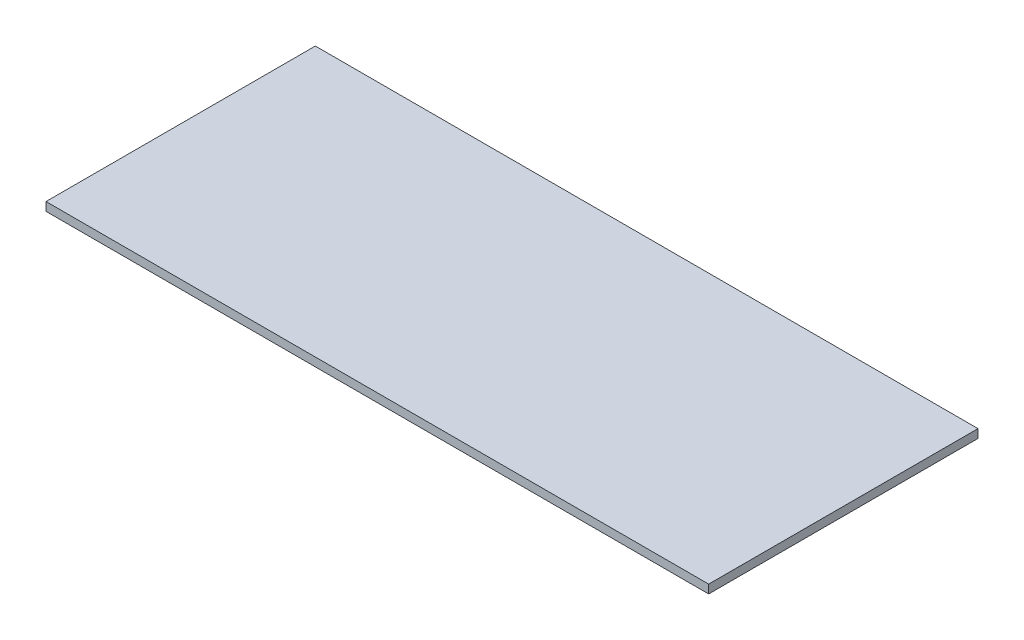
ISO-10303-21;
HEADER;
FILE_DESCRIPTION(('STEP AP214'),'2;1');
FILE_NAME('part.step','',(''),(''),'','','');
FILE_SCHEMA(('AUTOMOTIVE_DESIGN { 1 0 10303 214 1 1 1 1 }'));
ENDSEC;
DATA;
#1=APPLICATION_CONTEXT('core data for automotive mechanical design processes');
#2=APPLICATION_PROTOCOL_DEFINITION('international standard','automotive_design',2000,#1);
#3=PRODUCT_CONTEXT('',#1,'mechanical');
#4=PRODUCT('Part','Part','',(#3));
#5=PRODUCT_RELATED_PRODUCT_CATEGORY('part','',(#4));
#6=PRODUCT_DEFINITION_FORMATION('','',#4);
#7=PRODUCT_DEFINITION_CONTEXT('part definition',#1,'design');
#8=PRODUCT_DEFINITION('design','',#6,#7);
#9=PRODUCT_DEFINITION_SHAPE('','',#8);
#10=(LENGTH_UNIT() NAMED_UNIT(*) SI_UNIT(.MILLI.,.METRE.));
#11=(NAMED_UNIT(*) PLANE_ANGLE_UNIT() SI_UNIT($,.RADIAN.));
#12=(NAMED_UNIT(*) SI_UNIT($,.STERADIAN.) SOLID_ANGLE_UNIT());
#13=UNCERTAINTY_MEASURE_WITH_UNIT(LENGTH_MEASURE(1.E-05),#10,'distance_accuracy_value','');
#14=(GEOMETRIC_REPRESENTATION_CONTEXT(3) GLOBAL_UNCERTAINTY_ASSIGNED_CONTEXT((#13)) GLOBAL_UNIT_ASSIGNED_CONTEXT((#10,
#11,#12)) REPRESENTATION_CONTEXT('',''));
#15=CARTESIAN_POINT('',(0.,0.,0.));
#16=DIRECTION('',(0.,0.,1.));
#17=DIRECTION('',(1.,0.,0.));
#18=AXIS2_PLACEMENT_3D('',#15,#16,#17);
#19=CARTESIAN_POINT('',(196.85,5.08,-80.01));
#20=DIRECTION('',(-1.,0.,0.));
#21=DIRECTION('',(0.,0.,1.));
#22=AXIS2_PLACEMENT_3D('',#19,#20,#21);
#23=PLANE('',#22);
#24=DIRECTION('',(0.,0.,-1.));
#25=VECTOR('',#24,1.);
#26=CARTESIAN_POINT('',(196.85,0.,-80.01));
#27=LINE('',#26,#25);
#28=CARTESIAN_POINT('',(196.85,0.,80.01));
#29=VERTEX_POINT('',#28);
#30=CARTESIAN_POINT('',(196.85,0.,-80.01));
#31=VERTEX_POINT('',#30);
#32=EDGE_CURVE('E113',#29,#31,#27,.T.);
#33=ORIENTED_EDGE('',*,*,#32,.T.);
#34=DIRECTION('',(0.,-1.,0.));
#35=VECTOR('',#34,1.);
#36=CARTESIAN_POINT('',(196.85,5.08,-80.01));
#37=LINE('',#36,#35);
#38=CARTESIAN_POINT('',(196.85,5.08,-80.01));
#39=VERTEX_POINT('',#38);
#40=EDGE_CURVE('E11',#39,#31,#37,.T.);
#41=ORIENTED_EDGE('',*,*,#40,.F.);
#42=DIRECTION('',(0.,0.,-1.));
#43=VECTOR('',#42,1.);
#44=CARTESIAN_POINT('',(196.85,5.08,-80.01));
#45=LINE('',#44,#43);
#46=CARTESIAN_POINT('',(196.85,5.08,80.01));
#47=VERTEX_POINT('',#46);
#48=EDGE_CURVE('E97',#47,#39,#45,.T.);
#49=ORIENTED_EDGE('',*,*,#48,.F.);
#50=DIRECTION('',(0.,-1.,0.));
#51=VECTOR('',#50,1.);
#52=CARTESIAN_POINT('',(196.85,5.08,80.01));
#53=LINE('',#52,#51);
#54=EDGE_CURVE('E109',#47,#29,#53,.T.);
#55=ORIENTED_EDGE('',*,*,#54,.T.);
#56=EDGE_LOOP('',(#33,#41,#49,#55));
#57=FACE_BOUND('',#56,.T.);
#58=ADVANCED_FACE('F45',(#57),#23,.F.);
#59=CARTESIAN_POINT('',(-196.85,5.08,-80.01));
#60=DIRECTION('',(0.,0.,1.));
#61=DIRECTION('',(1.,0.,0.));
#62=AXIS2_PLACEMENT_3D('',#59,#60,#61);
#63=PLANE('',#62);
#64=DIRECTION('',(-1.,0.,0.));
#65=VECTOR('',#64,1.);
#66=CARTESIAN_POINT('',(-196.85,0.,-80.01));
#67=LINE('',#66,#65);
#68=CARTESIAN_POINT('',(-196.85,0.,-80.01));
#69=VERTEX_POINT('',#68);
#70=EDGE_CURVE('E102',#31,#69,#67,.T.);
#71=ORIENTED_EDGE('',*,*,#70,.T.);
#72=DIRECTION('',(0.,-1.,0.));
#73=VECTOR('',#72,1.);
#74=CARTESIAN_POINT('',(-196.85,5.08,-80.01));
#75=LINE('',#74,#73);
#76=CARTESIAN_POINT('',(-196.85,5.08,-80.01));
#77=VERTEX_POINT('',#76);
#78=EDGE_CURVE('E54',#77,#69,#75,.T.);
#79=ORIENTED_EDGE('',*,*,#78,.F.);
#80=DIRECTION('',(-1.,0.,0.));
#81=VECTOR('',#80,1.);
#82=CARTESIAN_POINT('',(-196.85,5.08,-80.01));
#83=LINE('',#82,#81);
#84=EDGE_CURVE('E92',#39,#77,#83,.T.);
#85=ORIENTED_EDGE('',*,*,#84,.F.);
#86=ORIENTED_EDGE('',*,*,#40,.T.);
#87=EDGE_LOOP('',(#71,#79,#85,#86));
#88=FACE_BOUND('',#87,.T.);
#89=ADVANCED_FACE('F101',(#88),#63,.F.);
#90=CARTESIAN_POINT('',(-196.85,5.08,-80.01));
#91=DIRECTION('',(1.,0.,0.));
#92=DIRECTION('',(0.,0.,-1.));
#93=AXIS2_PLACEMENT_3D('',#90,#91,#92);
#94=PLANE('',#93);
#95=DIRECTION('',(0.,0.,1.));
#96=VECTOR('',#95,1.);
#97=CARTESIAN_POINT('',(-196.85,0.,-80.01));
#98=LINE('',#97,#96);
#99=CARTESIAN_POINT('',(-196.85,0.,80.01));
#100=VERTEX_POINT('',#99);
#101=EDGE_CURVE('E79',#69,#100,#98,.T.);
#102=ORIENTED_EDGE('',*,*,#101,.T.);
#103=DIRECTION('',(0.,-1.,0.));
#104=VECTOR('',#103,1.);
#105=CARTESIAN_POINT('',(-196.85,5.08,80.01));
#106=LINE('',#105,#104);
#107=CARTESIAN_POINT('',(-196.85,5.08,80.01));
#108=VERTEX_POINT('',#107);
#109=EDGE_CURVE('E104',#108,#100,#106,.T.);
#110=ORIENTED_EDGE('',*,*,#109,.F.);
#111=DIRECTION('',(0.,0.,1.));
#112=VECTOR('',#111,1.);
#113=CARTESIAN_POINT('',(-196.85,5.08,-80.01));
#114=LINE('',#113,#112);
#115=EDGE_CURVE('E95',#77,#108,#114,.T.);
#116=ORIENTED_EDGE('',*,*,#115,.F.);
#117=ORIENTED_EDGE('',*,*,#78,.T.);
#118=EDGE_LOOP('',(#102,#110,#116,#117));
#119=FACE_BOUND('',#118,.T.);
#120=ADVANCED_FACE('F105',(#119),#94,.F.);
#121=CARTESIAN_POINT('',(-196.85,5.08,80.01));
#122=DIRECTION('',(0.,0.,-1.));
#123=DIRECTION('',(-1.,0.,0.));
#124=AXIS2_PLACEMENT_3D('',#121,#122,#123);
#125=PLANE('',#124);
#126=DIRECTION('',(1.,0.,0.));
#127=VECTOR('',#126,1.);
#128=CARTESIAN_POINT('',(-196.85,0.,80.01));
#129=LINE('',#128,#127);
#130=EDGE_CURVE('E85',#100,#29,#129,.T.);
#131=ORIENTED_EDGE('',*,*,#130,.T.);
#132=ORIENTED_EDGE('',*,*,#54,.F.);
#133=DIRECTION('',(1.,0.,0.));
#134=VECTOR('',#133,1.);
#135=CARTESIAN_POINT('',(-196.85,5.08,80.01));
#136=LINE('',#135,#134);
#137=EDGE_CURVE('E62',#108,#47,#136,.T.);
#138=ORIENTED_EDGE('',*,*,#137,.F.);
#139=ORIENTED_EDGE('',*,*,#109,.T.);
#140=EDGE_LOOP('',(#131,#132,#138,#139));
#141=FACE_BOUND('',#140,.T.);
#142=ADVANCED_FACE('F126',(#141),#125,.F.);
#143=CARTESIAN_POINT('',(0.,5.08,0.));
#144=DIRECTION('',(0.,1.,0.));
#145=DIRECTION('',(0.,0.,1.));
#146=AXIS2_PLACEMENT_3D('',#143,#144,#145);
#147=PLANE('',#146);
#148=ORIENTED_EDGE('',*,*,#48,.T.);
#149=ORIENTED_EDGE('',*,*,#84,.T.);
#150=ORIENTED_EDGE('',*,*,#115,.T.);
#151=ORIENTED_EDGE('',*,*,#137,.T.);
#152=EDGE_LOOP('',(#148,#149,#150,#151));
#153=FACE_BOUND('',#152,.T.);
#154=ADVANCED_FACE('F93',(#153),#147,.T.);
#155=CARTESIAN_POINT('',(0.,0.,0.));
#156=DIRECTION('',(0.,1.,0.));
#157=DIRECTION('',(0.,0.,1.));
#158=AXIS2_PLACEMENT_3D('',#155,#156,#157);
#159=PLANE('',#158);
#160=ORIENTED_EDGE('',*,*,#32,.F.);
#161=ORIENTED_EDGE('',*,*,#130,.F.);
#162=ORIENTED_EDGE('',*,*,#101,.F.);
#163=ORIENTED_EDGE('',*,*,#70,.F.);
#164=EDGE_LOOP('',(#160,#161,#162,#163));
#165=FACE_BOUND('',#164,.T.);
#166=ADVANCED_FACE('F129',(#165),#159,.F.);
#167=CLOSED_SHELL('',(#58,#89,#120,#142,#154,#166));
#168=MANIFOLD_SOLID_BREP('B2',#167);
#169=ADVANCED_BREP_SHAPE_REPRESENTATION('',(#18,#168),#14);
#170=SHAPE_DEFINITION_REPRESENTATION(#9,#169);
ENDSEC;
END-ISO-10303-21;
